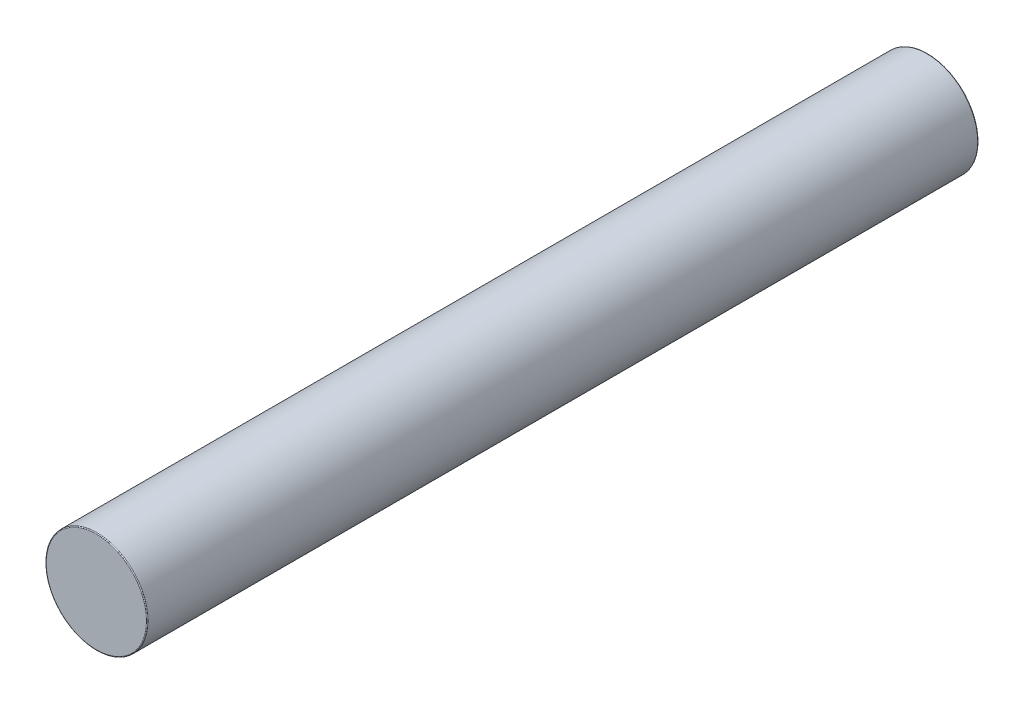
ISO-10303-21;
HEADER;
FILE_DESCRIPTION(('STEP AP214'),'2;1');
FILE_NAME('part.step','',(''),(''),'','','');
FILE_SCHEMA(('AUTOMOTIVE_DESIGN { 1 0 10303 214 1 1 1 1 }'));
ENDSEC;
DATA;
#1=APPLICATION_CONTEXT('core data for automotive mechanical design processes');
#2=APPLICATION_PROTOCOL_DEFINITION('international standard','automotive_design',2000,#1);
#3=PRODUCT_CONTEXT('',#1,'mechanical');
#4=PRODUCT('Part','Part','',(#3));
#5=PRODUCT_RELATED_PRODUCT_CATEGORY('part','',(#4));
#6=PRODUCT_DEFINITION_FORMATION('','',#4);
#7=PRODUCT_DEFINITION_CONTEXT('part definition',#1,'design');
#8=PRODUCT_DEFINITION('design','',#6,#7);
#9=PRODUCT_DEFINITION_SHAPE('','',#8);
#10=(LENGTH_UNIT() NAMED_UNIT(*) SI_UNIT(.MILLI.,.METRE.));
#11=(NAMED_UNIT(*) PLANE_ANGLE_UNIT() SI_UNIT($,.RADIAN.));
#12=(NAMED_UNIT(*) SI_UNIT($,.STERADIAN.) SOLID_ANGLE_UNIT());
#13=UNCERTAINTY_MEASURE_WITH_UNIT(LENGTH_MEASURE(1.E-05),#10,'distance_accuracy_value','');
#14=(GEOMETRIC_REPRESENTATION_CONTEXT(3) GLOBAL_UNCERTAINTY_ASSIGNED_CONTEXT((#13)) GLOBAL_UNIT_ASSIGNED_CONTEXT((#10,
#11,#12)) REPRESENTATION_CONTEXT('',''));
#15=CARTESIAN_POINT('',(0.,0.,0.));
#16=DIRECTION('',(0.,0.,1.));
#17=DIRECTION('',(1.,0.,0.));
#18=AXIS2_PLACEMENT_3D('',#15,#16,#17);
#19=CARTESIAN_POINT('',(0.,0.,20.));
#20=DIRECTION('',(0.,0.,-1.));
#21=DIRECTION('',(-1.,0.,0.));
#22=AXIS2_PLACEMENT_3D('',#19,#20,#21);
#23=CYLINDRICAL_SURFACE('',#22,1.225);
#24=CARTESIAN_POINT('',(0.,0.,0.0199999999999992));
#25=DIRECTION('',(0.,0.,1.));
#26=DIRECTION('',(1.,0.,0.));
#27=AXIS2_PLACEMENT_3D('',#24,#25,#26);
#28=CIRCLE('',#27,1.225);
#29=CARTESIAN_POINT('',(1.225,0.,0.0199999999999992));
#30=VERTEX_POINT('',#29);
#31=EDGE_CURVE('E50',#30,#30,#28,.T.);
#32=ORIENTED_EDGE('',*,*,#31,.T.);
#33=EDGE_LOOP('',(#32));
#34=FACE_BOUND('',#33,.T.);
#35=CARTESIAN_POINT('',(0.,0.,19.98));
#36=DIRECTION('',(0.,0.,1.));
#37=DIRECTION('',(1.,0.,0.));
#38=AXIS2_PLACEMENT_3D('',#35,#36,#37);
#39=CIRCLE('',#38,1.225);
#40=CARTESIAN_POINT('',(1.225,0.,19.98));
#41=VERTEX_POINT('',#40);
#42=EDGE_CURVE('E55',#41,#41,#39,.F.);
#43=ORIENTED_EDGE('',*,*,#42,.T.);
#44=EDGE_LOOP('',(#43));
#45=FACE_BOUND('',#44,.T.);
#46=ADVANCED_FACE('F37',(#34,#45),#23,.T.);
#47=CARTESIAN_POINT('',(0.,0.,20.));
#48=DIRECTION('',(0.,0.,1.));
#49=DIRECTION('',(1.,0.,0.));
#50=AXIS2_PLACEMENT_3D('',#47,#48,#49);
#51=PLANE('',#50);
#52=CARTESIAN_POINT('',(0.,0.,20.));
#53=DIRECTION('',(0.,0.,1.));
#54=DIRECTION('',(1.,0.,0.));
#55=AXIS2_PLACEMENT_3D('',#52,#53,#54);
#56=CIRCLE('',#55,1.205);
#57=CARTESIAN_POINT('',(1.205,0.,20.));
#58=VERTEX_POINT('',#57);
#59=EDGE_CURVE('E10',#58,#58,#56,.T.);
#60=ORIENTED_EDGE('',*,*,#59,.T.);
#61=EDGE_LOOP('',(#60));
#62=FACE_BOUND('',#61,.T.);
#63=ADVANCED_FACE('F72',(#62),#51,.T.);
#64=CARTESIAN_POINT('',(0.,0.,0.));
#65=DIRECTION('',(0.,0.,1.));
#66=DIRECTION('',(1.,0.,0.));
#67=AXIS2_PLACEMENT_3D('',#64,#65,#66);
#68=PLANE('',#67);
#69=CARTESIAN_POINT('',(0.,0.,0.));
#70=DIRECTION('',(0.,0.,1.));
#71=DIRECTION('',(1.,0.,0.));
#72=AXIS2_PLACEMENT_3D('',#69,#70,#71);
#73=CIRCLE('',#72,1.205);
#74=CARTESIAN_POINT('',(1.205,0.,0.));
#75=VERTEX_POINT('',#74);
#76=EDGE_CURVE('E45',#75,#75,#73,.F.);
#77=ORIENTED_EDGE('',*,*,#76,.T.);
#78=EDGE_LOOP('',(#77));
#79=FACE_BOUND('',#78,.T.);
#80=ADVANCED_FACE('F69',(#79),#68,.F.);
#81=CARTESIAN_POINT('',(0.,0.,0.0199999999999992));
#82=DIRECTION('',(0.,0.,1.));
#83=DIRECTION('',(1.,0.,0.));
#84=AXIS2_PLACEMENT_3D('',#81,#82,#83);
#85=TOROIDAL_SURFACE('',#84,1.205,0.02);
#86=ORIENTED_EDGE('',*,*,#76,.F.);
#87=EDGE_LOOP('',(#86));
#88=FACE_BOUND('',#87,.T.);
#89=ORIENTED_EDGE('',*,*,#31,.F.);
#90=EDGE_LOOP('',(#89));
#91=FACE_BOUND('',#90,.T.);
#92=ADVANCED_FACE('F65',(#88,#91),#85,.T.);
#93=CARTESIAN_POINT('',(0.,0.,19.98));
#94=DIRECTION('',(0.,0.,1.));
#95=DIRECTION('',(1.,0.,0.));
#96=AXIS2_PLACEMENT_3D('',#93,#94,#95);
#97=TOROIDAL_SURFACE('',#96,1.205,0.02);
#98=ORIENTED_EDGE('',*,*,#42,.F.);
#99=EDGE_LOOP('',(#98));
#100=FACE_BOUND('',#99,.T.);
#101=ORIENTED_EDGE('',*,*,#59,.F.);
#102=EDGE_LOOP('',(#101));
#103=FACE_BOUND('',#102,.T.);
#104=ADVANCED_FACE('F39',(#100,#103),#97,.T.);
#105=CLOSED_SHELL('',(#46,#63,#80,#92,#104));
#106=MANIFOLD_SOLID_BREP('B2',#105);
#107=ADVANCED_BREP_SHAPE_REPRESENTATION('',(#18,#106),#14);
#108=SHAPE_DEFINITION_REPRESENTATION(#9,#107);
ENDSEC;
END-ISO-10303-21;
